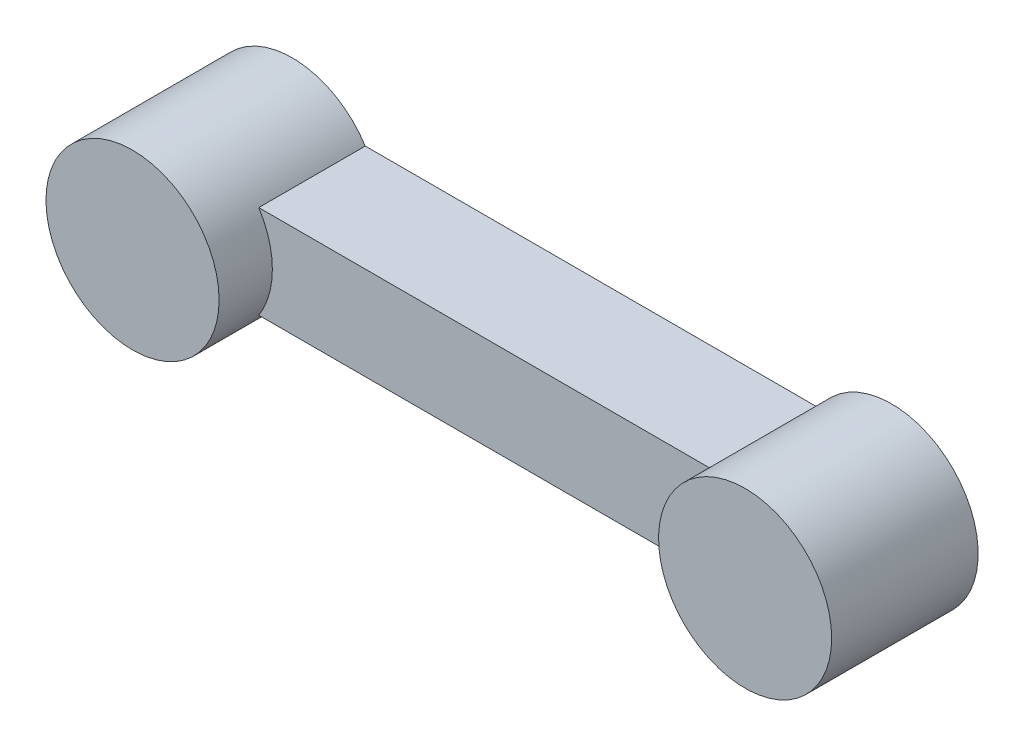
ISO-10303-21;
HEADER;
FILE_DESCRIPTION(('STEP AP214'),'2;1');
FILE_NAME('part.step','',(''),(''),'','','');
FILE_SCHEMA(('AUTOMOTIVE_DESIGN { 1 0 10303 214 1 1 1 1 }'));
ENDSEC;
DATA;
#1=APPLICATION_CONTEXT('core data for automotive mechanical design processes');
#2=APPLICATION_PROTOCOL_DEFINITION('international standard','automotive_design',2000,#1);
#3=PRODUCT_CONTEXT('',#1,'mechanical');
#4=PRODUCT('Part','Part','',(#3));
#5=PRODUCT_RELATED_PRODUCT_CATEGORY('part','',(#4));
#6=PRODUCT_DEFINITION_FORMATION('','',#4);
#7=PRODUCT_DEFINITION_CONTEXT('part definition',#1,'design');
#8=PRODUCT_DEFINITION('design','',#6,#7);
#9=PRODUCT_DEFINITION_SHAPE('','',#8);
#10=(LENGTH_UNIT() NAMED_UNIT(*) SI_UNIT(.MILLI.,.METRE.));
#11=(NAMED_UNIT(*) PLANE_ANGLE_UNIT() SI_UNIT($,.RADIAN.));
#12=(NAMED_UNIT(*) SI_UNIT($,.STERADIAN.) SOLID_ANGLE_UNIT());
#13=UNCERTAINTY_MEASURE_WITH_UNIT(LENGTH_MEASURE(1.E-05),#10,'distance_accuracy_value','');
#14=(GEOMETRIC_REPRESENTATION_CONTEXT(3) GLOBAL_UNCERTAINTY_ASSIGNED_CONTEXT((#13)) GLOBAL_UNIT_ASSIGNED_CONTEXT((#10,
#11,#12)) REPRESENTATION_CONTEXT('',''));
#15=CARTESIAN_POINT('',(0.,0.,0.));
#16=DIRECTION('',(0.,0.,1.));
#17=DIRECTION('',(1.,0.,0.));
#18=AXIS2_PLACEMENT_3D('',#15,#16,#17);
#19=CARTESIAN_POINT('',(20.,5.,16.));
#20=DIRECTION('',(0.,1.,0.));
#21=DIRECTION('',(0.,0.,1.));
#22=AXIS2_PLACEMENT_3D('',#19,#20,#21);
#23=PLANE('',#22);
#24=DIRECTION('',(0.,0.,-1.));
#25=VECTOR('',#24,1.);
#26=CARTESIAN_POINT('',(99.0455488498967,5.,22.));
#27=LINE('',#26,#25);
#28=CARTESIAN_POINT('',(99.0455488498967,5.,16.));
#29=VERTEX_POINT('',#28);
#30=CARTESIAN_POINT('',(99.0455488498967,5.,0.));
#31=VERTEX_POINT('',#30);
#32=EDGE_CURVE('E84',#29,#31,#27,.T.);
#33=ORIENTED_EDGE('',*,*,#32,.F.);
#34=DIRECTION('',(1.,0.,0.));
#35=VECTOR('',#34,1.);
#36=CARTESIAN_POINT('',(20.,5.,16.));
#37=LINE('',#36,#35);
#38=CARTESIAN_POINT('',(30.9544511501033,5.,16.));
#39=VERTEX_POINT('',#38);
#40=EDGE_CURVE('E49',#39,#29,#37,.T.);
#41=ORIENTED_EDGE('',*,*,#40,.F.);
#42=DIRECTION('',(0.,0.,-1.));
#43=VECTOR('',#42,1.);
#44=CARTESIAN_POINT('',(30.9544511501033,5.,24.));
#45=LINE('',#44,#43);
#46=CARTESIAN_POINT('',(30.9544511501033,5.,0.));
#47=VERTEX_POINT('',#46);
#48=EDGE_CURVE('E65',#47,#39,#45,.F.);
#49=ORIENTED_EDGE('',*,*,#48,.F.);
#50=DIRECTION('',(1.,0.,0.));
#51=VECTOR('',#50,1.);
#52=CARTESIAN_POINT('',(20.,5.,0.));
#53=LINE('',#52,#51);
#54=EDGE_CURVE('E101',#47,#31,#53,.T.);
#55=ORIENTED_EDGE('',*,*,#54,.T.);
#56=EDGE_LOOP('',(#33,#41,#49,#55));
#57=FACE_BOUND('',#56,.T.);
#58=ADVANCED_FACE('F41',(#57),#23,.F.);
#59=CARTESIAN_POINT('',(110.,19.,16.));
#60=DIRECTION('',(0.,-1.,0.));
#61=DIRECTION('',(0.,0.,-1.));
#62=AXIS2_PLACEMENT_3D('',#59,#60,#61);
#63=PLANE('',#62);
#64=DIRECTION('',(0.,0.,-1.));
#65=VECTOR('',#64,1.);
#66=CARTESIAN_POINT('',(99.0455488498967,19.,22.));
#67=LINE('',#66,#65);
#68=CARTESIAN_POINT('',(99.0455488498967,19.,0.));
#69=VERTEX_POINT('',#68);
#70=CARTESIAN_POINT('',(99.0455488498967,19.,16.));
#71=VERTEX_POINT('',#70);
#72=EDGE_CURVE('E57',#69,#71,#67,.F.);
#73=ORIENTED_EDGE('',*,*,#72,.F.);
#74=DIRECTION('',(-1.,0.,0.));
#75=VECTOR('',#74,1.);
#76=CARTESIAN_POINT('',(110.,19.,0.));
#77=LINE('',#76,#75);
#78=CARTESIAN_POINT('',(30.9544511501033,19.,0.));
#79=VERTEX_POINT('',#78);
#80=EDGE_CURVE('E44',#69,#79,#77,.T.);
#81=ORIENTED_EDGE('',*,*,#80,.T.);
#82=DIRECTION('',(0.,0.,-1.));
#83=VECTOR('',#82,1.);
#84=CARTESIAN_POINT('',(30.9544511501033,19.,24.));
#85=LINE('',#84,#83);
#86=CARTESIAN_POINT('',(30.9544511501033,19.,16.));
#87=VERTEX_POINT('',#86);
#88=EDGE_CURVE('E105',#87,#79,#85,.T.);
#89=ORIENTED_EDGE('',*,*,#88,.F.);
#90=DIRECTION('',(-1.,0.,0.));
#91=VECTOR('',#90,1.);
#92=CARTESIAN_POINT('',(110.,19.,16.));
#93=LINE('',#92,#91);
#94=EDGE_CURVE('E11',#71,#87,#93,.T.);
#95=ORIENTED_EDGE('',*,*,#94,.F.);
#96=EDGE_LOOP('',(#73,#81,#89,#95));
#97=FACE_BOUND('',#96,.T.);
#98=ADVANCED_FACE('F93',(#97),#63,.F.);
#99=CARTESIAN_POINT('',(0.,0.,16.));
#100=DIRECTION('',(0.,0.,1.));
#101=DIRECTION('',(1.,0.,0.));
#102=AXIS2_PLACEMENT_3D('',#99,#100,#101);
#103=PLANE('',#102);
#104=ORIENTED_EDGE('',*,*,#40,.T.);
#105=CARTESIAN_POINT('',(110.,12.,16.));
#106=DIRECTION('',(0.,0.,1.));
#107=DIRECTION('',(1.,0.,0.));
#108=AXIS2_PLACEMENT_3D('',#105,#106,#107);
#109=CIRCLE('',#108,13.);
#110=EDGE_CURVE('E96',#29,#71,#109,.F.);
#111=ORIENTED_EDGE('',*,*,#110,.T.);
#112=ORIENTED_EDGE('',*,*,#94,.T.);
#113=CARTESIAN_POINT('',(20.,12.,16.));
#114=DIRECTION('',(0.,0.,1.));
#115=DIRECTION('',(1.,0.,0.));
#116=AXIS2_PLACEMENT_3D('',#113,#114,#115);
#117=CIRCLE('',#116,13.);
#118=EDGE_CURVE('E109',#87,#39,#117,.F.);
#119=ORIENTED_EDGE('',*,*,#118,.T.);
#120=EDGE_LOOP('',(#104,#111,#112,#119));
#121=FACE_BOUND('',#120,.T.);
#122=ADVANCED_FACE('F138',(#121),#103,.T.);
#123=CARTESIAN_POINT('',(0.,0.,0.));
#124=DIRECTION('',(0.,0.,1.));
#125=DIRECTION('',(1.,0.,0.));
#126=AXIS2_PLACEMENT_3D('',#123,#124,#125);
#127=PLANE('',#126);
#128=ORIENTED_EDGE('',*,*,#80,.F.);
#129=CARTESIAN_POINT('',(110.,12.,0.));
#130=DIRECTION('',(0.,0.,1.));
#131=DIRECTION('',(1.,0.,0.));
#132=AXIS2_PLACEMENT_3D('',#129,#130,#131);
#133=CIRCLE('',#132,13.);
#134=EDGE_CURVE('E81',#31,#69,#133,.T.);
#135=ORIENTED_EDGE('',*,*,#134,.F.);
#136=ORIENTED_EDGE('',*,*,#54,.F.);
#137=CARTESIAN_POINT('',(20.,12.,0.));
#138=DIRECTION('',(0.,0.,1.));
#139=DIRECTION('',(1.,0.,0.));
#140=AXIS2_PLACEMENT_3D('',#137,#138,#139);
#141=CIRCLE('',#140,13.);
#142=EDGE_CURVE('E100',#79,#47,#141,.T.);
#143=ORIENTED_EDGE('',*,*,#142,.F.);
#144=EDGE_LOOP('',(#128,#135,#136,#143));
#145=FACE_BOUND('',#144,.T.);
#146=ADVANCED_FACE('F99',(#145),#127,.F.);
#147=CARTESIAN_POINT('',(20.,12.,24.));
#148=DIRECTION('',(0.,0.,-1.));
#149=DIRECTION('',(-1.,0.,0.));
#150=AXIS2_PLACEMENT_3D('',#147,#148,#149);
#151=CYLINDRICAL_SURFACE('',#150,13.);
#152=CARTESIAN_POINT('',(20.,12.,24.));
#153=DIRECTION('',(0.,0.,1.));
#154=DIRECTION('',(1.,0.,0.));
#155=AXIS2_PLACEMENT_3D('',#152,#153,#154);
#156=CIRCLE('',#155,13.);
#157=CARTESIAN_POINT('',(33.,12.,24.));
#158=VERTEX_POINT('',#157);
#159=EDGE_CURVE('E111',#158,#158,#156,.T.);
#160=ORIENTED_EDGE('',*,*,#159,.F.);
#161=EDGE_LOOP('',(#160));
#162=FACE_BOUND('',#161,.T.);
#163=ORIENTED_EDGE('',*,*,#142,.T.);
#164=ORIENTED_EDGE('',*,*,#48,.T.);
#165=ORIENTED_EDGE('',*,*,#118,.F.);
#166=ORIENTED_EDGE('',*,*,#88,.T.);
#167=EDGE_LOOP('',(#163,#164,#165,#166));
#168=FACE_BOUND('',#167,.T.);
#169=ADVANCED_FACE('F131',(#162,#168),#151,.T.);
#170=CARTESIAN_POINT('',(20.,12.,24.));
#171=DIRECTION('',(0.,0.,1.));
#172=DIRECTION('',(1.,0.,0.));
#173=AXIS2_PLACEMENT_3D('',#170,#171,#172);
#174=PLANE('',#173);
#175=ORIENTED_EDGE('',*,*,#159,.T.);
#176=EDGE_LOOP('',(#175));
#177=FACE_BOUND('',#176,.T.);
#178=ADVANCED_FACE('F123',(#177),#174,.T.);
#179=CARTESIAN_POINT('',(110.,12.,22.));
#180=DIRECTION('',(0.,0.,-1.));
#181=DIRECTION('',(-1.,0.,0.));
#182=AXIS2_PLACEMENT_3D('',#179,#180,#181);
#183=CYLINDRICAL_SURFACE('',#182,13.);
#184=CARTESIAN_POINT('',(110.,12.,22.));
#185=DIRECTION('',(0.,0.,1.));
#186=DIRECTION('',(1.,0.,0.));
#187=AXIS2_PLACEMENT_3D('',#184,#185,#186);
#188=CIRCLE('',#187,13.);
#189=CARTESIAN_POINT('',(123.,12.,22.));
#190=VERTEX_POINT('',#189);
#191=EDGE_CURVE('E89',#190,#190,#188,.T.);
#192=ORIENTED_EDGE('',*,*,#191,.F.);
#193=EDGE_LOOP('',(#192));
#194=FACE_BOUND('',#193,.T.);
#195=ORIENTED_EDGE('',*,*,#110,.F.);
#196=ORIENTED_EDGE('',*,*,#32,.T.);
#197=ORIENTED_EDGE('',*,*,#134,.T.);
#198=ORIENTED_EDGE('',*,*,#72,.T.);
#199=EDGE_LOOP('',(#195,#196,#197,#198));
#200=FACE_BOUND('',#199,.T.);
#201=ADVANCED_FACE('F82',(#194,#200),#183,.T.);
#202=CARTESIAN_POINT('',(110.,12.,22.));
#203=DIRECTION('',(0.,0.,1.));
#204=DIRECTION('',(1.,0.,0.));
#205=AXIS2_PLACEMENT_3D('',#202,#203,#204);
#206=PLANE('',#205);
#207=ORIENTED_EDGE('',*,*,#191,.T.);
#208=EDGE_LOOP('',(#207));
#209=FACE_BOUND('',#208,.T.);
#210=ADVANCED_FACE('F120',(#209),#206,.T.);
#211=CLOSED_SHELL('',(#58,#98,#122,#146,#169,#178,#201,#210));
#212=MANIFOLD_SOLID_BREP('B2',#211);
#213=ADVANCED_BREP_SHAPE_REPRESENTATION('',(#18,#212),#14);
#214=SHAPE_DEFINITION_REPRESENTATION(#9,#213);
ENDSEC;
END-ISO-10303-21;
